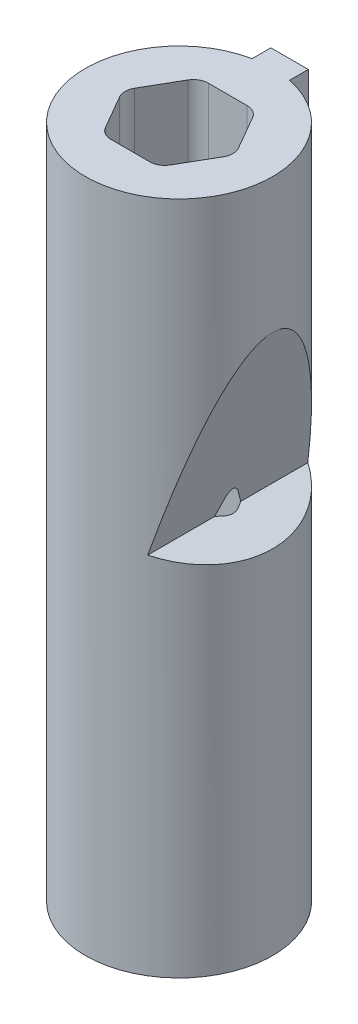
ISO-10303-21;
HEADER;
FILE_DESCRIPTION(('STEP AP214'),'2;1');
FILE_NAME('part.step','',(''),(''),'','','');
FILE_SCHEMA(('AUTOMOTIVE_DESIGN { 1 0 10303 214 1 1 1 1 }'));
ENDSEC;
DATA;
#1=APPLICATION_CONTEXT('core data for automotive mechanical design processes');
#2=APPLICATION_PROTOCOL_DEFINITION('international standard','automotive_design',2000,#1);
#3=PRODUCT_CONTEXT('',#1,'mechanical');
#4=PRODUCT('Part','Part','',(#3));
#5=PRODUCT_RELATED_PRODUCT_CATEGORY('part','',(#4));
#6=PRODUCT_DEFINITION_FORMATION('','',#4);
#7=PRODUCT_DEFINITION_CONTEXT('part definition',#1,'design');
#8=PRODUCT_DEFINITION('design','',#6,#7);
#9=PRODUCT_DEFINITION_SHAPE('','',#8);
#10=(LENGTH_UNIT() NAMED_UNIT(*) SI_UNIT(.MILLI.,.METRE.));
#11=(NAMED_UNIT(*) PLANE_ANGLE_UNIT() SI_UNIT($,.RADIAN.));
#12=(NAMED_UNIT(*) SI_UNIT($,.STERADIAN.) SOLID_ANGLE_UNIT());
#13=UNCERTAINTY_MEASURE_WITH_UNIT(LENGTH_MEASURE(1.E-05),#10,'distance_accuracy_value','');
#14=(GEOMETRIC_REPRESENTATION_CONTEXT(3) GLOBAL_UNCERTAINTY_ASSIGNED_CONTEXT((#13)) GLOBAL_UNIT_ASSIGNED_CONTEXT((#10,
#11,#12)) REPRESENTATION_CONTEXT('',''));
#15=CARTESIAN_POINT('',(0.,0.,0.));
#16=DIRECTION('',(0.,0.,1.));
#17=DIRECTION('',(1.,0.,0.));
#18=AXIS2_PLACEMENT_3D('',#15,#16,#17);
#19=CARTESIAN_POINT('',(0.,18.,0.));
#20=DIRECTION('',(0.,-1.,0.));
#21=DIRECTION('',(0.,0.,-1.));
#22=AXIS2_PLACEMENT_3D('',#19,#20,#21);
#23=CYLINDRICAL_SURFACE('',#22,2.5);
#24=CARTESIAN_POINT('',(0.,0.,0.));
#25=DIRECTION('',(0.,1.,0.));
#26=DIRECTION('',(0.,0.,1.));
#27=AXIS2_PLACEMENT_3D('',#24,#25,#26);
#28=CIRCLE('',#27,2.5);
#29=CARTESIAN_POINT('',(0.,0.,2.5));
#30=VERTEX_POINT('',#29);
#31=EDGE_CURVE('E293',#30,#30,#28,.T.);
#32=ORIENTED_EDGE('',*,*,#31,.T.);
#33=EDGE_LOOP('',(#32));
#34=FACE_BOUND('',#33,.T.);
#35=CARTESIAN_POINT('',(0.,13.,0.));
#36=DIRECTION('',(0.,1.,0.));
#37=DIRECTION('',(0.,0.,1.));
#38=AXIS2_PLACEMENT_3D('',#35,#36,#37);
#39=CIRCLE('',#38,2.5);
#40=CARTESIAN_POINT('',(0.5,13.,-2.44948974278318));
#41=VERTEX_POINT('',#40);
#42=CARTESIAN_POINT('',(-0.5,13.,-2.44948974278318));
#43=VERTEX_POINT('',#42);
#44=EDGE_CURVE('E303',#41,#43,#39,.T.);
#45=ORIENTED_EDGE('',*,*,#44,.F.);
#46=DIRECTION('',(0.,1.,0.));
#47=VECTOR('',#46,1.);
#48=CARTESIAN_POINT('',(0.5,13.,-2.44948974278318));
#49=LINE('',#48,#47);
#50=CARTESIAN_POINT('',(0.5,18.,-2.44948974278318));
#51=VERTEX_POINT('',#50);
#52=EDGE_CURVE('E290',#41,#51,#49,.T.);
#53=ORIENTED_EDGE('',*,*,#52,.T.);
#54=CARTESIAN_POINT('',(0.,18.,0.));
#55=DIRECTION('',(0.,1.,0.));
#56=DIRECTION('',(0.,0.,1.));
#57=AXIS2_PLACEMENT_3D('',#54,#55,#56);
#58=CIRCLE('',#57,2.5);
#59=CARTESIAN_POINT('',(-0.5,18.,-2.44948974278318));
#60=VERTEX_POINT('',#59);
#61=EDGE_CURVE('E300',#60,#51,#58,.T.);
#62=ORIENTED_EDGE('',*,*,#61,.F.);
#63=DIRECTION('',(0.,1.,0.));
#64=VECTOR('',#63,1.);
#65=CARTESIAN_POINT('',(-0.5,13.,-2.44948974278318));
#66=LINE('',#65,#64);
#67=EDGE_CURVE('E294',#43,#60,#66,.T.);
#68=ORIENTED_EDGE('',*,*,#67,.F.);
#69=EDGE_LOOP('',(#45,#53,#62,#68));
#70=FACE_BOUND('',#69,.T.);
#71=CARTESIAN_POINT('',(0.,4.65320631441115,0.));
#72=DIRECTION('',(0.968644205631642,-0.248452013266638,0.));
#73=DIRECTION('',(-0.248452013266638,-0.968644205631642,0.));
#74=AXIS2_PLACEMENT_3D('',#71,#72,#73);
#75=ELLIPSE('',#74,10.0623052601993,2.5);
#76=CARTESIAN_POINT('',(1.3,9.72153903091735,-2.13541565040626));
#77=VERTEX_POINT('',#76);
#78=CARTESIAN_POINT('',(1.3,9.72153903091735,2.13541565040626));
#79=VERTEX_POINT('',#78);
#80=EDGE_CURVE('E310',#77,#79,#75,.T.);
#81=ORIENTED_EDGE('',*,*,#80,.F.);
#82=CARTESIAN_POINT('',(0.,10.0698729810778,0.));
#83=DIRECTION('',(0.258819045102524,0.965925826289068,0.));
#84=DIRECTION('',(0.965925826289068,-0.258819045102524,0.));
#85=AXIS2_PLACEMENT_3D('',#82,#83,#84);
#86=ELLIPSE('',#85,2.58819045102521,2.5);
#87=EDGE_CURVE('E307',#79,#77,#86,.T.);
#88=ORIENTED_EDGE('',*,*,#87,.F.);
#89=EDGE_LOOP('',(#81,#88));
#90=FACE_BOUND('',#89,.T.);
#91=ADVANCED_FACE('F33',(#34,#70,#90),#23,.T.);
#92=CARTESIAN_POINT('',(0.,18.,0.));
#93=DIRECTION('',(0.,1.,0.));
#94=DIRECTION('',(0.,0.,1.));
#95=AXIS2_PLACEMENT_3D('',#92,#93,#94);
#96=PLANE('',#95);
#97=CARTESIAN_POINT('',(0.519059892324149,18.,0.899038105676658));
#98=DIRECTION('',(0.,1.,0.));
#99=DIRECTION('',(0.,0.,1.));
#100=AXIS2_PLACEMENT_3D('',#97,#98,#99);
#101=CIRCLE('',#100,0.4);
#102=CARTESIAN_POINT('',(0.519059892324149,18.,1.29903810567666));
#103=VERTEX_POINT('',#102);
#104=CARTESIAN_POINT('',(0.865470053837925,18.,1.09903810567666));
#105=VERTEX_POINT('',#104);
#106=EDGE_CURVE('E266',#103,#105,#101,.T.);
#107=ORIENTED_EDGE('',*,*,#106,.F.);
#108=DIRECTION('',(1.,0.,0.));
#109=VECTOR('',#108,1.);
#110=CARTESIAN_POINT('',(0.,18.,1.29903810567666));
#111=LINE('',#110,#109);
#112=CARTESIAN_POINT('',(-0.51905989232415,18.,1.29903810567666));
#113=VERTEX_POINT('',#112);
#114=EDGE_CURVE('E251',#113,#103,#111,.T.);
#115=ORIENTED_EDGE('',*,*,#114,.F.);
#116=CARTESIAN_POINT('',(-0.51905989232415,18.,0.899038105676658));
#117=DIRECTION('',(0.,1.,0.));
#118=DIRECTION('',(0.,0.,1.));
#119=AXIS2_PLACEMENT_3D('',#116,#117,#118);
#120=CIRCLE('',#119,0.4);
#121=CARTESIAN_POINT('',(-0.865470053837925,18.,1.09903810567666));
#122=VERTEX_POINT('',#121);
#123=EDGE_CURVE('E174',#122,#113,#120,.T.);
#124=ORIENTED_EDGE('',*,*,#123,.F.);
#125=DIRECTION('',(0.5,0.,0.866025403784439));
#126=VECTOR('',#125,1.);
#127=CARTESIAN_POINT('',(-1.125,18.,0.649519052838329));
#128=LINE('',#127,#126);
#129=CARTESIAN_POINT('',(-1.38452994616208,18.,0.2));
#130=VERTEX_POINT('',#129);
#131=EDGE_CURVE('E254',#130,#122,#128,.T.);
#132=ORIENTED_EDGE('',*,*,#131,.F.);
#133=CARTESIAN_POINT('',(-1.0381197846483,18.,0.));
#134=DIRECTION('',(0.,1.,0.));
#135=DIRECTION('',(0.,0.,1.));
#136=AXIS2_PLACEMENT_3D('',#133,#134,#135);
#137=CIRCLE('',#136,0.4);
#138=CARTESIAN_POINT('',(-1.38452994616207,18.,-0.2));
#139=VERTEX_POINT('',#138);
#140=EDGE_CURVE('E256',#139,#130,#137,.T.);
#141=ORIENTED_EDGE('',*,*,#140,.F.);
#142=DIRECTION('',(-0.5,0.,0.866025403784439));
#143=VECTOR('',#142,1.);
#144=CARTESIAN_POINT('',(-1.125,18.,-0.649519052838329));
#145=LINE('',#144,#143);
#146=CARTESIAN_POINT('',(-0.865470053837925,18.,-1.09903810567666));
#147=VERTEX_POINT('',#146);
#148=EDGE_CURVE('E258',#147,#139,#145,.T.);
#149=ORIENTED_EDGE('',*,*,#148,.F.);
#150=CARTESIAN_POINT('',(-0.51905989232415,18.,-0.899038105676657));
#151=DIRECTION('',(0.,1.,0.));
#152=DIRECTION('',(0.,0.,1.));
#153=AXIS2_PLACEMENT_3D('',#150,#151,#152);
#154=CIRCLE('',#153,0.4);
#155=CARTESIAN_POINT('',(-0.51905989232415,18.,-1.29903810567666));
#156=VERTEX_POINT('',#155);
#157=EDGE_CURVE('E260',#156,#147,#154,.T.);
#158=ORIENTED_EDGE('',*,*,#157,.F.);
#159=DIRECTION('',(-1.,0.,0.));
#160=VECTOR('',#159,1.);
#161=CARTESIAN_POINT('',(0.,18.,-1.29903810567666));
#162=LINE('',#161,#160);
#163=CARTESIAN_POINT('',(0.51905989232415,18.,-1.29903810567666));
#164=VERTEX_POINT('',#163);
#165=EDGE_CURVE('E262',#164,#156,#162,.T.);
#166=ORIENTED_EDGE('',*,*,#165,.F.);
#167=CARTESIAN_POINT('',(0.51905989232415,18.,-0.899038105676657));
#168=DIRECTION('',(0.,1.,0.));
#169=DIRECTION('',(0.,0.,1.));
#170=AXIS2_PLACEMENT_3D('',#167,#168,#169);
#171=CIRCLE('',#170,0.4);
#172=CARTESIAN_POINT('',(0.865470053837925,18.,-1.09903810567666));
#173=VERTEX_POINT('',#172);
#174=EDGE_CURVE('E264',#173,#164,#171,.T.);
#175=ORIENTED_EDGE('',*,*,#174,.F.);
#176=DIRECTION('',(-0.5,0.,-0.866025403784439));
#177=VECTOR('',#176,1.);
#178=CARTESIAN_POINT('',(1.125,18.,-0.649519052838329));
#179=LINE('',#178,#177);
#180=CARTESIAN_POINT('',(1.38452994616207,18.,-0.2));
#181=VERTEX_POINT('',#180);
#182=EDGE_CURVE('E241',#181,#173,#179,.T.);
#183=ORIENTED_EDGE('',*,*,#182,.F.);
#184=CARTESIAN_POINT('',(1.0381197846483,18.,0.));
#185=DIRECTION('',(0.,1.,0.));
#186=DIRECTION('',(0.,0.,1.));
#187=AXIS2_PLACEMENT_3D('',#184,#185,#186);
#188=CIRCLE('',#187,0.4);
#189=CARTESIAN_POINT('',(1.38452994616207,18.,0.2));
#190=VERTEX_POINT('',#189);
#191=EDGE_CURVE('E245',#190,#181,#188,.T.);
#192=ORIENTED_EDGE('',*,*,#191,.F.);
#193=DIRECTION('',(0.5,0.,-0.866025403784439));
#194=VECTOR('',#193,1.);
#195=CARTESIAN_POINT('',(1.125,18.,0.649519052838329));
#196=LINE('',#195,#194);
#197=EDGE_CURVE('E249',#105,#190,#196,.T.);
#198=ORIENTED_EDGE('',*,*,#197,.F.);
#199=EDGE_LOOP('',(#107,#115,#124,#132,#141,#149,#158,#166,#175,#183,#192,#198));
#200=FACE_BOUND('',#199,.T.);
#201=ORIENTED_EDGE('',*,*,#61,.T.);
#202=DIRECTION('',(0.,0.,-1.));
#203=VECTOR('',#202,1.);
#204=CARTESIAN_POINT('',(0.5,18.,-2.94948974278318));
#205=LINE('',#204,#203);
#206=CARTESIAN_POINT('',(0.5,18.,-2.94948974278318));
#207=VERTEX_POINT('',#206);
#208=EDGE_CURVE('E272',#51,#207,#205,.T.);
#209=ORIENTED_EDGE('',*,*,#208,.T.);
#210=DIRECTION('',(-1.,0.,0.));
#211=VECTOR('',#210,1.);
#212=CARTESIAN_POINT('',(-0.5,18.,-2.94948974278318));
#213=LINE('',#212,#211);
#214=CARTESIAN_POINT('',(-0.5,18.,-2.94948974278318));
#215=VERTEX_POINT('',#214);
#216=EDGE_CURVE('E286',#207,#215,#213,.T.);
#217=ORIENTED_EDGE('',*,*,#216,.T.);
#218=DIRECTION('',(0.,0.,1.));
#219=VECTOR('',#218,1.);
#220=CARTESIAN_POINT('',(-0.5,18.,-2.44948974278318));
#221=LINE('',#220,#219);
#222=EDGE_CURVE('E277',#215,#60,#221,.T.);
#223=ORIENTED_EDGE('',*,*,#222,.T.);
#224=EDGE_LOOP('',(#201,#209,#217,#223));
#225=FACE_BOUND('',#224,.T.);
#226=ADVANCED_FACE('F345',(#200,#225),#96,.T.);
#227=CARTESIAN_POINT('',(0.,0.,0.));
#228=DIRECTION('',(0.,1.,0.));
#229=DIRECTION('',(0.,0.,1.));
#230=AXIS2_PLACEMENT_3D('',#227,#228,#229);
#231=PLANE('',#230);
#232=DIRECTION('',(-1.,0.,0.));
#233=VECTOR('',#232,1.);
#234=CARTESIAN_POINT('',(0.519059892324149,0.,1.29903810567666));
#235=LINE('',#234,#233);
#236=CARTESIAN_POINT('',(0.519059892324149,0.,1.29903810567666));
#237=VERTEX_POINT('',#236);
#238=CARTESIAN_POINT('',(-0.51905989232415,0.,1.29903810567666));
#239=VERTEX_POINT('',#238);
#240=EDGE_CURVE('E180',#237,#239,#235,.T.);
#241=ORIENTED_EDGE('',*,*,#240,.F.);
#242=CARTESIAN_POINT('',(0.519059892324149,0.,0.899038105676658));
#243=DIRECTION('',(0.,-1.,0.));
#244=DIRECTION('',(0.,0.,-1.));
#245=AXIS2_PLACEMENT_3D('',#242,#243,#244);
#246=CIRCLE('',#245,0.4);
#247=CARTESIAN_POINT('',(0.865470053837925,0.,1.09903810567666));
#248=VERTEX_POINT('',#247);
#249=EDGE_CURVE('E55',#248,#237,#246,.T.);
#250=ORIENTED_EDGE('',*,*,#249,.F.);
#251=DIRECTION('',(-0.5,0.,0.866025403784439));
#252=VECTOR('',#251,1.);
#253=CARTESIAN_POINT('',(1.38452994616207,0.,0.2));
#254=LINE('',#253,#252);
#255=CARTESIAN_POINT('',(1.38452994616207,0.,0.2));
#256=VERTEX_POINT('',#255);
#257=EDGE_CURVE('E214',#256,#248,#254,.T.);
#258=ORIENTED_EDGE('',*,*,#257,.F.);
#259=CARTESIAN_POINT('',(1.0381197846483,0.,0.));
#260=DIRECTION('',(0.,-1.,0.));
#261=DIRECTION('',(0.,0.,-1.));
#262=AXIS2_PLACEMENT_3D('',#259,#260,#261);
#263=CIRCLE('',#262,0.4);
#264=CARTESIAN_POINT('',(1.38452994616207,0.,-0.2));
#265=VERTEX_POINT('',#264);
#266=EDGE_CURVE('E211',#265,#256,#263,.T.);
#267=ORIENTED_EDGE('',*,*,#266,.F.);
#268=DIRECTION('',(0.5,0.,0.866025403784439));
#269=VECTOR('',#268,1.);
#270=CARTESIAN_POINT('',(0.865470053837925,0.,-1.09903810567666));
#271=LINE('',#270,#269);
#272=CARTESIAN_POINT('',(0.865470053837925,0.,-1.09903810567666));
#273=VERTEX_POINT('',#272);
#274=EDGE_CURVE('E208',#273,#265,#271,.T.);
#275=ORIENTED_EDGE('',*,*,#274,.F.);
#276=CARTESIAN_POINT('',(0.51905989232415,0.,-0.899038105676657));
#277=DIRECTION('',(0.,-1.,0.));
#278=DIRECTION('',(0.,0.,-1.));
#279=AXIS2_PLACEMENT_3D('',#276,#277,#278);
#280=CIRCLE('',#279,0.4);
#281=CARTESIAN_POINT('',(0.51905989232415,0.,-1.29903810567666));
#282=VERTEX_POINT('',#281);
#283=EDGE_CURVE('E205',#282,#273,#280,.T.);
#284=ORIENTED_EDGE('',*,*,#283,.F.);
#285=DIRECTION('',(1.,0.,0.));
#286=VECTOR('',#285,1.);
#287=CARTESIAN_POINT('',(-0.51905989232415,0.,-1.29903810567666));
#288=LINE('',#287,#286);
#289=CARTESIAN_POINT('',(-0.51905989232415,0.,-1.29903810567666));
#290=VERTEX_POINT('',#289);
#291=EDGE_CURVE('E202',#290,#282,#288,.T.);
#292=ORIENTED_EDGE('',*,*,#291,.F.);
#293=CARTESIAN_POINT('',(-0.51905989232415,0.,-0.899038105676657));
#294=DIRECTION('',(0.,-1.,0.));
#295=DIRECTION('',(0.,0.,1.));
#296=AXIS2_PLACEMENT_3D('',#293,#294,#295);
#297=CIRCLE('',#296,0.4);
#298=CARTESIAN_POINT('',(-0.865470053837925,0.,-1.09903810567666));
#299=VERTEX_POINT('',#298);
#300=EDGE_CURVE('E199',#299,#290,#297,.T.);
#301=ORIENTED_EDGE('',*,*,#300,.F.);
#302=DIRECTION('',(0.5,0.,-0.866025403784439));
#303=VECTOR('',#302,1.);
#304=CARTESIAN_POINT('',(-1.38452994616207,0.,-0.2));
#305=LINE('',#304,#303);
#306=CARTESIAN_POINT('',(-1.38452994616207,0.,-0.2));
#307=VERTEX_POINT('',#306);
#308=EDGE_CURVE('E196',#307,#299,#305,.T.);
#309=ORIENTED_EDGE('',*,*,#308,.F.);
#310=CARTESIAN_POINT('',(-1.0381197846483,0.,0.));
#311=DIRECTION('',(0.,-1.,0.));
#312=DIRECTION('',(0.,0.,-1.));
#313=AXIS2_PLACEMENT_3D('',#310,#311,#312);
#314=CIRCLE('',#313,0.4);
#315=CARTESIAN_POINT('',(-1.38452994616208,0.,0.2));
#316=VERTEX_POINT('',#315);
#317=EDGE_CURVE('E190',#316,#307,#314,.T.);
#318=ORIENTED_EDGE('',*,*,#317,.F.);
#319=DIRECTION('',(-0.5,0.,-0.866025403784439));
#320=VECTOR('',#319,1.);
#321=CARTESIAN_POINT('',(-0.865470053837925,0.,1.09903810567666));
#322=LINE('',#321,#320);
#323=CARTESIAN_POINT('',(-0.865470053837925,0.,1.09903810567666));
#324=VERTEX_POINT('',#323);
#325=EDGE_CURVE('E188',#324,#316,#322,.T.);
#326=ORIENTED_EDGE('',*,*,#325,.F.);
#327=CARTESIAN_POINT('',(-0.51905989232415,0.,0.899038105676658));
#328=DIRECTION('',(0.,-1.,0.));
#329=DIRECTION('',(0.,0.,-1.));
#330=AXIS2_PLACEMENT_3D('',#327,#328,#329);
#331=CIRCLE('',#330,0.4);
#332=EDGE_CURVE('E171',#239,#324,#331,.T.);
#333=ORIENTED_EDGE('',*,*,#332,.F.);
#334=EDGE_LOOP('',(#241,#250,#258,#267,#275,#284,#292,#301,#309,#318,#326,#333));
#335=FACE_BOUND('',#334,.T.);
#336=ORIENTED_EDGE('',*,*,#31,.F.);
#337=EDGE_LOOP('',(#336));
#338=FACE_BOUND('',#337,.T.);
#339=ADVANCED_FACE('F184',(#335,#338),#231,.F.);
#340=CARTESIAN_POINT('',(0.5,13.,-2.94948974278318));
#341=DIRECTION('',(1.,0.,0.));
#342=DIRECTION('',(0.,0.,-1.));
#343=AXIS2_PLACEMENT_3D('',#340,#341,#342);
#344=PLANE('',#343);
#345=ORIENTED_EDGE('',*,*,#208,.F.);
#346=ORIENTED_EDGE('',*,*,#52,.F.);
#347=DIRECTION('',(0.,0.,-1.));
#348=VECTOR('',#347,1.);
#349=CARTESIAN_POINT('',(0.5,13.,-2.94948974278318));
#350=LINE('',#349,#348);
#351=CARTESIAN_POINT('',(0.5,13.,-2.94948974278318));
#352=VERTEX_POINT('',#351);
#353=EDGE_CURVE('E273',#41,#352,#350,.T.);
#354=ORIENTED_EDGE('',*,*,#353,.T.);
#355=DIRECTION('',(0.,1.,0.));
#356=VECTOR('',#355,1.);
#357=CARTESIAN_POINT('',(0.5,13.,-2.94948974278318));
#358=LINE('',#357,#356);
#359=EDGE_CURVE('E283',#352,#207,#358,.T.);
#360=ORIENTED_EDGE('',*,*,#359,.T.);
#361=EDGE_LOOP('',(#345,#346,#354,#360));
#362=FACE_BOUND('',#361,.T.);
#363=ADVANCED_FACE('F394',(#362),#344,.T.);
#364=CARTESIAN_POINT('',(-0.5,13.,-2.44948974278318));
#365=DIRECTION('',(-1.,0.,0.));
#366=DIRECTION('',(0.,0.,1.));
#367=AXIS2_PLACEMENT_3D('',#364,#365,#366);
#368=PLANE('',#367);
#369=ORIENTED_EDGE('',*,*,#222,.F.);
#370=DIRECTION('',(0.,1.,0.));
#371=VECTOR('',#370,1.);
#372=CARTESIAN_POINT('',(-0.5,13.,-2.94948974278318));
#373=LINE('',#372,#371);
#374=CARTESIAN_POINT('',(-0.5,13.,-2.94948974278318));
#375=VERTEX_POINT('',#374);
#376=EDGE_CURVE('E297',#375,#215,#373,.T.);
#377=ORIENTED_EDGE('',*,*,#376,.F.);
#378=DIRECTION('',(0.,0.,1.));
#379=VECTOR('',#378,1.);
#380=CARTESIAN_POINT('',(-0.5,13.,-2.44948974278318));
#381=LINE('',#380,#379);
#382=EDGE_CURVE('E280',#375,#43,#381,.T.);
#383=ORIENTED_EDGE('',*,*,#382,.T.);
#384=ORIENTED_EDGE('',*,*,#67,.T.);
#385=EDGE_LOOP('',(#369,#377,#383,#384));
#386=FACE_BOUND('',#385,.T.);
#387=ADVANCED_FACE('F389',(#386),#368,.T.);
#388=CARTESIAN_POINT('',(-0.5,13.,-2.94948974278318));
#389=DIRECTION('',(0.,0.,-1.));
#390=DIRECTION('',(-1.,0.,0.));
#391=AXIS2_PLACEMENT_3D('',#388,#389,#390);
#392=PLANE('',#391);
#393=ORIENTED_EDGE('',*,*,#216,.F.);
#394=ORIENTED_EDGE('',*,*,#359,.F.);
#395=DIRECTION('',(-1.,0.,0.));
#396=VECTOR('',#395,1.);
#397=CARTESIAN_POINT('',(-0.5,13.,-2.94948974278318));
#398=LINE('',#397,#396);
#399=EDGE_CURVE('E276',#352,#375,#398,.T.);
#400=ORIENTED_EDGE('',*,*,#399,.T.);
#401=ORIENTED_EDGE('',*,*,#376,.T.);
#402=EDGE_LOOP('',(#393,#394,#400,#401));
#403=FACE_BOUND('',#402,.T.);
#404=ADVANCED_FACE('F392',(#403),#392,.T.);
#405=CARTESIAN_POINT('',(0.,13.,0.));
#406=DIRECTION('',(0.,1.,0.));
#407=DIRECTION('',(0.,0.,1.));
#408=AXIS2_PLACEMENT_3D('',#405,#406,#407);
#409=PLANE('',#408);
#410=ORIENTED_EDGE('',*,*,#353,.F.);
#411=ORIENTED_EDGE('',*,*,#44,.T.);
#412=ORIENTED_EDGE('',*,*,#382,.F.);
#413=ORIENTED_EDGE('',*,*,#399,.F.);
#414=EDGE_LOOP('',(#410,#411,#412,#413));
#415=FACE_BOUND('',#414,.T.);
#416=ADVANCED_FACE('F385',(#415),#409,.F.);
#417=CARTESIAN_POINT('',(2.5,14.4,4.));
#418=DIRECTION('',(0.968644205631642,-0.248452013266638,0.));
#419=DIRECTION('',(0.248452013266638,0.968644205631642,0.));
#420=AXIS2_PLACEMENT_3D('',#417,#418,#419);
#421=PLANE('',#420);
#422=DIRECTION('',(-0.228217744513515,-0.889756508465465,0.395284728686182));
#423=VECTOR('',#422,1.);
#424=CARTESIAN_POINT('',(1.9829060263819,12.3839966892332,-0.836417772974651));
#425=LINE('',#424,#423);
#426=CARTESIAN_POINT('',(1.38452994616207,10.0510974091156,0.2));
#427=VERTEX_POINT('',#426);
#428=CARTESIAN_POINT('',(1.3,9.72153903091735,0.346410161513775));
#429=VERTEX_POINT('',#428);
#430=EDGE_CURVE('E247',#427,#429,#425,.T.);
#431=ORIENTED_EDGE('',*,*,#430,.F.);
#432=CARTESIAN_POINT('',(1.0381197846483,8.70054205916911,0.));
#433=DIRECTION('',(0.968644205631642,-0.248452013266638,0.));
#434=DIRECTION('',(-0.248452013266638,-0.968644205631642,0.));
#435=AXIS2_PLACEMENT_3D('',#432,#433,#434);
#436=ELLIPSE('',#435,1.60996884163189,0.4);
#437=CARTESIAN_POINT('',(1.38452994616207,10.0510974091156,-0.200000000000002));
#438=VERTEX_POINT('',#437);
#439=EDGE_CURVE('E243',#438,#427,#436,.T.);
#440=ORIENTED_EDGE('',*,*,#439,.F.);
#441=DIRECTION('',(0.228217744513516,0.889756508465465,0.395284728686182));
#442=VECTOR('',#441,1.);
#443=CARTESIAN_POINT('',(2.70459394015308,15.1976539695975,2.08641790683472));
#444=LINE('',#443,#442);
#445=CARTESIAN_POINT('',(1.3,9.72153903091735,-0.346410161513775));
#446=VERTEX_POINT('',#445);
#447=EDGE_CURVE('E219',#446,#438,#444,.T.);
#448=ORIENTED_EDGE('',*,*,#447,.F.);
#449=DIRECTION('',(0.,0.,-1.));
#450=VECTOR('',#449,1.);
#451=CARTESIAN_POINT('',(1.3,9.72153903091735,4.));
#452=LINE('',#451,#450);
#453=EDGE_CURVE('E268',#446,#77,#452,.T.);
#454=ORIENTED_EDGE('',*,*,#453,.T.);
#455=ORIENTED_EDGE('',*,*,#80,.T.);
#456=EDGE_CURVE('E269',#79,#429,#452,.T.);
#457=ORIENTED_EDGE('',*,*,#456,.T.);
#458=EDGE_LOOP('',(#431,#440,#448,#454,#455,#457));
#459=FACE_BOUND('',#458,.T.);
#460=ADVANCED_FACE('F332',(#459),#421,.T.);
#461=CARTESIAN_POINT('',(1.3,9.72153903091735,4.));
#462=DIRECTION('',(0.258819045102524,0.965925826289068,0.));
#463=DIRECTION('',(-0.965925826289068,0.258819045102524,0.));
#464=AXIS2_PLACEMENT_3D('',#461,#462,#463);
#465=PLANE('',#464);
#466=DIRECTION('',(0.495572219835078,-0.13278817609611,-0.858356263574049));
#467=VECTOR('',#466,1.);
#468=CARTESIAN_POINT('',(-0.254154980751578,10.1379736029225,3.03828555101174));
#469=LINE('',#468,#467);
#470=CARTESIAN_POINT('',(1.38452994616207,9.69888930010698,0.2));
#471=VERTEX_POINT('',#470);
#472=EDGE_CURVE('E11',#429,#471,#469,.T.);
#473=ORIENTED_EDGE('',*,*,#472,.F.);
#474=ORIENTED_EDGE('',*,*,#456,.F.);
#475=ORIENTED_EDGE('',*,*,#87,.T.);
#476=ORIENTED_EDGE('',*,*,#453,.F.);
#477=DIRECTION('',(-0.495572219835078,0.13278817609611,-0.858356263574048));
#478=VECTOR('',#477,1.);
#479=CARTESIAN_POINT('',(3.1488651708383,9.22613710147719,2.85591825072267));
#480=LINE('',#479,#478);
#481=CARTESIAN_POINT('',(1.38452994616207,9.69888930010698,-0.2));
#482=VERTEX_POINT('',#481);
#483=EDGE_CURVE('E313',#482,#446,#480,.T.);
#484=ORIENTED_EDGE('',*,*,#483,.F.);
#485=CARTESIAN_POINT('',(1.0381197846483,9.79170962313453,0.));
#486=DIRECTION('',(0.258819045102524,0.965925826289068,0.));
#487=DIRECTION('',(0.965925826289068,-0.258819045102524,0.));
#488=AXIS2_PLACEMENT_3D('',#485,#486,#487);
#489=ELLIPSE('',#488,0.414110472164034,0.4);
#490=EDGE_CURVE('E40',#471,#482,#489,.T.);
#491=ORIENTED_EDGE('',*,*,#490,.F.);
#492=EDGE_LOOP('',(#473,#474,#475,#476,#484,#491));
#493=FACE_BOUND('',#492,.T.);
#494=ADVANCED_FACE('F323',(#493),#465,.T.);
#495=CARTESIAN_POINT('',(1.0381197846483,34.,0.));
#496=DIRECTION('',(0.,-1.,0.));
#497=DIRECTION('',(0.,0.,-1.));
#498=AXIS2_PLACEMENT_3D('',#495,#496,#497);
#499=CYLINDRICAL_SURFACE('',#498,0.4);
#500=ORIENTED_EDGE('',*,*,#191,.T.);
#501=DIRECTION('',(0.,-1.,0.));
#502=VECTOR('',#501,1.);
#503=CARTESIAN_POINT('',(1.38452994616207,34.,-0.2));
#504=LINE('',#503,#502);
#505=EDGE_CURVE('E223',#181,#438,#504,.T.);
#506=ORIENTED_EDGE('',*,*,#505,.T.);
#507=ORIENTED_EDGE('',*,*,#439,.T.);
#508=DIRECTION('',(0.,-1.,0.));
#509=VECTOR('',#508,1.);
#510=CARTESIAN_POINT('',(1.38452994616207,34.,0.2));
#511=LINE('',#510,#509);
#512=EDGE_CURVE('E220',#190,#427,#511,.T.);
#513=ORIENTED_EDGE('',*,*,#512,.F.);
#514=EDGE_LOOP('',(#500,#506,#507,#513));
#515=FACE_BOUND('',#514,.T.);
#516=ADVANCED_FACE('F337',(#515),#499,.F.);
#517=CARTESIAN_POINT('',(0.519059892324149,34.,0.899038105676658));
#518=DIRECTION('',(0.,-1.,0.));
#519=DIRECTION('',(0.,0.,-1.));
#520=AXIS2_PLACEMENT_3D('',#517,#518,#519);
#521=CYLINDRICAL_SURFACE('',#520,0.4);
#522=ORIENTED_EDGE('',*,*,#106,.T.);
#523=DIRECTION('',(0.,-1.,0.));
#524=VECTOR('',#523,1.);
#525=CARTESIAN_POINT('',(0.865470053837925,34.,1.09903810567666));
#526=LINE('',#525,#524);
#527=EDGE_CURVE('E217',#105,#248,#526,.T.);
#528=ORIENTED_EDGE('',*,*,#527,.T.);
#529=ORIENTED_EDGE('',*,*,#249,.T.);
#530=DIRECTION('',(0.,-1.,0.));
#531=VECTOR('',#530,1.);
#532=CARTESIAN_POINT('',(0.519059892324149,34.,1.29903810567666));
#533=LINE('',#532,#531);
#534=EDGE_CURVE('E177',#103,#237,#533,.T.);
#535=ORIENTED_EDGE('',*,*,#534,.F.);
#536=EDGE_LOOP('',(#522,#528,#529,#535));
#537=FACE_BOUND('',#536,.T.);
#538=ADVANCED_FACE('F411',(#537),#521,.F.);
#539=CARTESIAN_POINT('',(1.38452994616207,34.,0.2));
#540=DIRECTION('',(0.866025403784439,0.,0.5));
#541=DIRECTION('',(0.5,0.,-0.866025403784439));
#542=AXIS2_PLACEMENT_3D('',#539,#540,#541);
#543=PLANE('',#542);
#544=ORIENTED_EDGE('',*,*,#197,.T.);
#545=ORIENTED_EDGE('',*,*,#512,.T.);
#546=ORIENTED_EDGE('',*,*,#430,.T.);
#547=ORIENTED_EDGE('',*,*,#472,.T.);
#548=EDGE_CURVE('E221',#471,#256,#511,.T.);
#549=ORIENTED_EDGE('',*,*,#548,.T.);
#550=ORIENTED_EDGE('',*,*,#257,.T.);
#551=ORIENTED_EDGE('',*,*,#527,.F.);
#552=EDGE_LOOP('',(#544,#545,#546,#547,#549,#550,#551));
#553=FACE_BOUND('',#552,.T.);
#554=ADVANCED_FACE('F340',(#553),#543,.F.);
#555=ORIENTED_EDGE('',*,*,#490,.T.);
#556=EDGE_CURVE('E224',#482,#265,#504,.T.);
#557=ORIENTED_EDGE('',*,*,#556,.T.);
#558=ORIENTED_EDGE('',*,*,#266,.T.);
#559=ORIENTED_EDGE('',*,*,#548,.F.);
#560=EDGE_LOOP('',(#555,#557,#558,#559));
#561=FACE_BOUND('',#560,.T.);
#562=ADVANCED_FACE('F319',(#561),#499,.F.);
#563=CARTESIAN_POINT('',(0.865470053837925,34.,-1.09903810567666));
#564=DIRECTION('',(0.866025403784439,0.,-0.5));
#565=DIRECTION('',(-0.5,0.,-0.866025403784439));
#566=AXIS2_PLACEMENT_3D('',#563,#564,#565);
#567=PLANE('',#566);
#568=ORIENTED_EDGE('',*,*,#182,.T.);
#569=DIRECTION('',(0.,-1.,0.));
#570=VECTOR('',#569,1.);
#571=CARTESIAN_POINT('',(0.865470053837925,34.,-1.09903810567666));
#572=LINE('',#571,#570);
#573=EDGE_CURVE('E226',#173,#273,#572,.T.);
#574=ORIENTED_EDGE('',*,*,#573,.T.);
#575=ORIENTED_EDGE('',*,*,#274,.T.);
#576=ORIENTED_EDGE('',*,*,#556,.F.);
#577=ORIENTED_EDGE('',*,*,#483,.T.);
#578=ORIENTED_EDGE('',*,*,#447,.T.);
#579=ORIENTED_EDGE('',*,*,#505,.F.);
#580=EDGE_LOOP('',(#568,#574,#575,#576,#577,#578,#579));
#581=FACE_BOUND('',#580,.T.);
#582=ADVANCED_FACE('F326',(#581),#567,.F.);
#583=CARTESIAN_POINT('',(0.51905989232415,34.,-0.899038105676657));
#584=DIRECTION('',(0.,-1.,0.));
#585=DIRECTION('',(0.,0.,-1.));
#586=AXIS2_PLACEMENT_3D('',#583,#584,#585);
#587=CYLINDRICAL_SURFACE('',#586,0.4);
#588=ORIENTED_EDGE('',*,*,#174,.T.);
#589=DIRECTION('',(0.,-1.,0.));
#590=VECTOR('',#589,1.);
#591=CARTESIAN_POINT('',(0.51905989232415,34.,-1.29903810567666));
#592=LINE('',#591,#590);
#593=EDGE_CURVE('E228',#164,#282,#592,.T.);
#594=ORIENTED_EDGE('',*,*,#593,.T.);
#595=ORIENTED_EDGE('',*,*,#283,.T.);
#596=ORIENTED_EDGE('',*,*,#573,.F.);
#597=EDGE_LOOP('',(#588,#594,#595,#596));
#598=FACE_BOUND('',#597,.T.);
#599=ADVANCED_FACE('F351',(#598),#587,.F.);
#600=CARTESIAN_POINT('',(-0.51905989232415,34.,-1.29903810567666));
#601=DIRECTION('',(0.,0.,-1.));
#602=DIRECTION('',(-1.,0.,0.));
#603=AXIS2_PLACEMENT_3D('',#600,#601,#602);
#604=PLANE('',#603);
#605=ORIENTED_EDGE('',*,*,#165,.T.);
#606=DIRECTION('',(0.,-1.,0.));
#607=VECTOR('',#606,1.);
#608=CARTESIAN_POINT('',(-0.51905989232415,34.,-1.29903810567666));
#609=LINE('',#608,#607);
#610=EDGE_CURVE('E230',#156,#290,#609,.T.);
#611=ORIENTED_EDGE('',*,*,#610,.T.);
#612=ORIENTED_EDGE('',*,*,#291,.T.);
#613=ORIENTED_EDGE('',*,*,#593,.F.);
#614=EDGE_LOOP('',(#605,#611,#612,#613));
#615=FACE_BOUND('',#614,.T.);
#616=ADVANCED_FACE('F360',(#615),#604,.F.);
#617=CARTESIAN_POINT('',(-0.51905989232415,34.,-0.899038105676657));
#618=DIRECTION('',(0.,-1.,0.));
#619=DIRECTION('',(0.,0.,-1.));
#620=AXIS2_PLACEMENT_3D('',#617,#618,#619);
#621=CYLINDRICAL_SURFACE('',#620,0.4);
#622=ORIENTED_EDGE('',*,*,#157,.T.);
#623=DIRECTION('',(0.,-1.,0.));
#624=VECTOR('',#623,1.);
#625=CARTESIAN_POINT('',(-0.865470053837925,34.,-1.09903810567666));
#626=LINE('',#625,#624);
#627=EDGE_CURVE('E232',#147,#299,#626,.T.);
#628=ORIENTED_EDGE('',*,*,#627,.T.);
#629=ORIENTED_EDGE('',*,*,#300,.T.);
#630=ORIENTED_EDGE('',*,*,#610,.F.);
#631=EDGE_LOOP('',(#622,#628,#629,#630));
#632=FACE_BOUND('',#631,.T.);
#633=ADVANCED_FACE('F362',(#632),#621,.F.);
#634=CARTESIAN_POINT('',(-1.38452994616207,34.,-0.2));
#635=DIRECTION('',(-0.866025403784439,0.,-0.5));
#636=DIRECTION('',(-0.5,0.,0.866025403784439));
#637=AXIS2_PLACEMENT_3D('',#634,#635,#636);
#638=PLANE('',#637);
#639=ORIENTED_EDGE('',*,*,#148,.T.);
#640=DIRECTION('',(0.,-1.,0.));
#641=VECTOR('',#640,1.);
#642=CARTESIAN_POINT('',(-1.38452994616207,34.,-0.2));
#643=LINE('',#642,#641);
#644=EDGE_CURVE('E234',#139,#307,#643,.T.);
#645=ORIENTED_EDGE('',*,*,#644,.T.);
#646=ORIENTED_EDGE('',*,*,#308,.T.);
#647=ORIENTED_EDGE('',*,*,#627,.F.);
#648=EDGE_LOOP('',(#639,#645,#646,#647));
#649=FACE_BOUND('',#648,.T.);
#650=ADVANCED_FACE('F425',(#649),#638,.F.);
#651=CARTESIAN_POINT('',(-1.0381197846483,34.,0.));
#652=DIRECTION('',(0.,-1.,0.));
#653=DIRECTION('',(0.,0.,-1.));
#654=AXIS2_PLACEMENT_3D('',#651,#652,#653);
#655=CYLINDRICAL_SURFACE('',#654,0.4);
#656=ORIENTED_EDGE('',*,*,#140,.T.);
#657=DIRECTION('',(0.,-1.,0.));
#658=VECTOR('',#657,1.);
#659=CARTESIAN_POINT('',(-1.38452994616208,34.,0.2));
#660=LINE('',#659,#658);
#661=EDGE_CURVE('E236',#130,#316,#660,.T.);
#662=ORIENTED_EDGE('',*,*,#661,.T.);
#663=ORIENTED_EDGE('',*,*,#317,.T.);
#664=ORIENTED_EDGE('',*,*,#644,.F.);
#665=EDGE_LOOP('',(#656,#662,#663,#664));
#666=FACE_BOUND('',#665,.T.);
#667=ADVANCED_FACE('F421',(#666),#655,.F.);
#668=CARTESIAN_POINT('',(-0.865470053837925,34.,1.09903810567666));
#669=DIRECTION('',(-0.866025403784439,0.,0.5));
#670=DIRECTION('',(0.5,0.,0.866025403784439));
#671=AXIS2_PLACEMENT_3D('',#668,#669,#670);
#672=PLANE('',#671);
#673=ORIENTED_EDGE('',*,*,#131,.T.);
#674=DIRECTION('',(0.,-1.,0.));
#675=VECTOR('',#674,1.);
#676=CARTESIAN_POINT('',(-0.865470053837925,34.,1.09903810567666));
#677=LINE('',#676,#675);
#678=EDGE_CURVE('E176',#122,#324,#677,.T.);
#679=ORIENTED_EDGE('',*,*,#678,.T.);
#680=ORIENTED_EDGE('',*,*,#325,.T.);
#681=ORIENTED_EDGE('',*,*,#661,.F.);
#682=EDGE_LOOP('',(#673,#679,#680,#681));
#683=FACE_BOUND('',#682,.T.);
#684=ADVANCED_FACE('F418',(#683),#672,.F.);
#685=CARTESIAN_POINT('',(-0.51905989232415,34.,0.899038105676658));
#686=DIRECTION('',(0.,-1.,0.));
#687=DIRECTION('',(0.,0.,-1.));
#688=AXIS2_PLACEMENT_3D('',#685,#686,#687);
#689=CYLINDRICAL_SURFACE('',#688,0.4);
#690=ORIENTED_EDGE('',*,*,#123,.T.);
#691=DIRECTION('',(0.,-1.,0.));
#692=VECTOR('',#691,1.);
#693=CARTESIAN_POINT('',(-0.51905989232415,34.,1.29903810567666));
#694=LINE('',#693,#692);
#695=EDGE_CURVE('E47',#113,#239,#694,.T.);
#696=ORIENTED_EDGE('',*,*,#695,.T.);
#697=ORIENTED_EDGE('',*,*,#332,.T.);
#698=ORIENTED_EDGE('',*,*,#678,.F.);
#699=EDGE_LOOP('',(#690,#696,#697,#698));
#700=FACE_BOUND('',#699,.T.);
#701=ADVANCED_FACE('F168',(#700),#689,.F.);
#702=CARTESIAN_POINT('',(0.519059892324149,34.,1.29903810567666));
#703=DIRECTION('',(0.,0.,1.));
#704=DIRECTION('',(1.,0.,0.));
#705=AXIS2_PLACEMENT_3D('',#702,#703,#704);
#706=PLANE('',#705);
#707=ORIENTED_EDGE('',*,*,#114,.T.);
#708=ORIENTED_EDGE('',*,*,#534,.T.);
#709=ORIENTED_EDGE('',*,*,#240,.T.);
#710=ORIENTED_EDGE('',*,*,#695,.F.);
#711=EDGE_LOOP('',(#707,#708,#709,#710));
#712=FACE_BOUND('',#711,.T.);
#713=ADVANCED_FACE('F181',(#712),#706,.F.);
#714=CLOSED_SHELL('',(#91,#226,#339,#363,#387,#404,#416,#460,#494,#516,#538,#554,#562,#582,#599,
#616,#633,#650,#667,#684,#701,#713));
#715=MANIFOLD_SOLID_BREP('B2',#714);
#716=ADVANCED_BREP_SHAPE_REPRESENTATION('',(#18,#715),#14);
#717=SHAPE_DEFINITION_REPRESENTATION(#9,#716);
ENDSEC;
END-ISO-10303-21;
